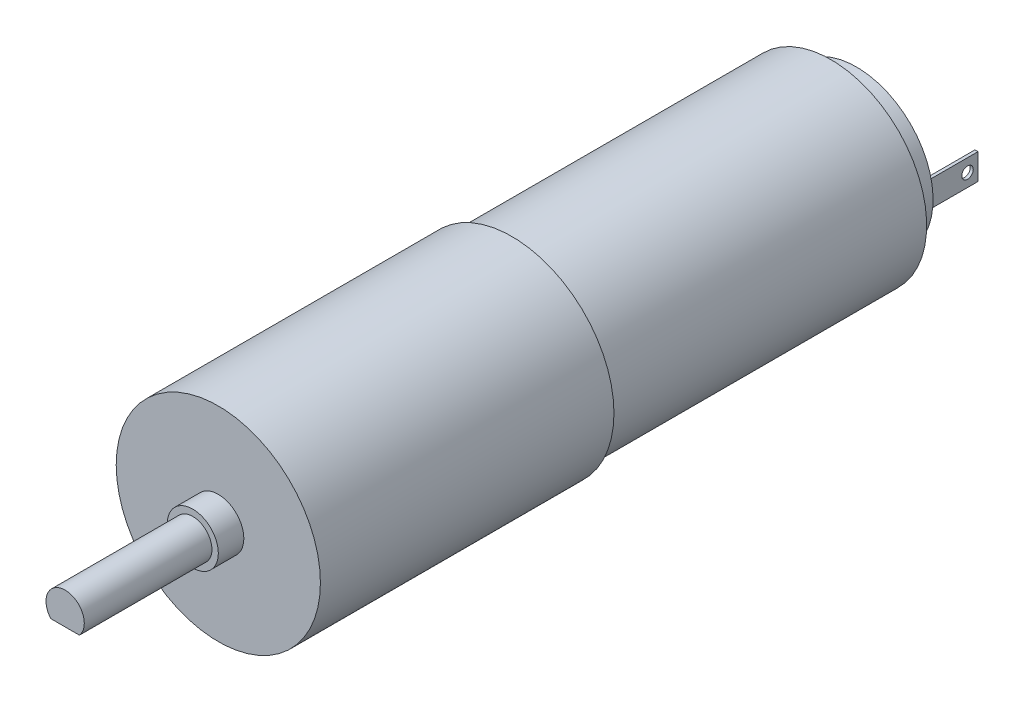
ISO-10303-21;
HEADER;
FILE_DESCRIPTION(('STEP AP214'),'2;1');
FILE_NAME('part.step','',(''),(''),'','','');
FILE_SCHEMA(('AUTOMOTIVE_DESIGN { 1 0 10303 214 1 1 1 1 }'));
ENDSEC;
DATA;
#1=APPLICATION_CONTEXT('core data for automotive mechanical design processes');
#2=APPLICATION_PROTOCOL_DEFINITION('international standard','automotive_design',2000,#1);
#3=PRODUCT_CONTEXT('',#1,'mechanical');
#4=PRODUCT('Part','Part','',(#3));
#5=PRODUCT_RELATED_PRODUCT_CATEGORY('part','',(#4));
#6=PRODUCT_DEFINITION_FORMATION('','',#4);
#7=PRODUCT_DEFINITION_CONTEXT('part definition',#1,'design');
#8=PRODUCT_DEFINITION('design','',#6,#7);
#9=PRODUCT_DEFINITION_SHAPE('','',#8);
#10=(LENGTH_UNIT() NAMED_UNIT(*) SI_UNIT(.MILLI.,.METRE.));
#11=(NAMED_UNIT(*) PLANE_ANGLE_UNIT() SI_UNIT($,.RADIAN.));
#12=(NAMED_UNIT(*) SI_UNIT($,.STERADIAN.) SOLID_ANGLE_UNIT());
#13=UNCERTAINTY_MEASURE_WITH_UNIT(LENGTH_MEASURE(1.E-05),#10,'distance_accuracy_value','');
#14=(GEOMETRIC_REPRESENTATION_CONTEXT(3) GLOBAL_UNCERTAINTY_ASSIGNED_CONTEXT((#13)) GLOBAL_UNIT_ASSIGNED_CONTEXT((#10,
#11,#12)) REPRESENTATION_CONTEXT('',''));
#15=CARTESIAN_POINT('',(0.,0.,0.));
#16=DIRECTION('',(0.,0.,1.));
#17=DIRECTION('',(1.,0.,0.));
#18=AXIS2_PLACEMENT_3D('',#15,#16,#17);
#19=CARTESIAN_POINT('',(0.,0.,-27.));
#20=DIRECTION('',(0.,0.,-1.));
#21=DIRECTION('',(-1.,0.,0.));
#22=AXIS2_PLACEMENT_3D('',#19,#20,#21);
#23=PLANE('',#22);
#24=CARTESIAN_POINT('',(0.,0.,-27.));
#25=DIRECTION('',(0.,0.,-1.));
#26=DIRECTION('',(-1.,0.,0.));
#27=AXIS2_PLACEMENT_3D('',#24,#25,#26);
#28=CIRCLE('',#27,6.);
#29=CARTESIAN_POINT('',(-6.,0.,-27.));
#30=VERTEX_POINT('',#29);
#31=EDGE_CURVE('E149',#30,#30,#28,.T.);
#32=ORIENTED_EDGE('',*,*,#31,.T.);
#33=EDGE_LOOP('',(#32));
#34=FACE_BOUND('',#33,.T.);
#35=DIRECTION('',(1.,0.,0.));
#36=VECTOR('',#35,1.);
#37=CARTESIAN_POINT('',(5.52102003642987,1.01467395264138,-27.));
#38=LINE('',#37,#36);
#39=CARTESIAN_POINT('',(5.28227322404372,1.01467395264138,-27.));
#40=VERTEX_POINT('',#39);
#41=CARTESIAN_POINT('',(5.52102003642987,1.01467395264138,-27.));
#42=VERTEX_POINT('',#41);
#43=EDGE_CURVE('E395',#40,#42,#38,.T.);
#44=ORIENTED_EDGE('',*,*,#43,.F.);
#45=DIRECTION('',(0.,1.,0.));
#46=VECTOR('',#45,1.);
#47=CARTESIAN_POINT('',(5.28227322404372,-1.01467395264138,-27.));
#48=LINE('',#47,#46);
#49=CARTESIAN_POINT('',(5.28227322404372,-1.01467395264138,-27.));
#50=VERTEX_POINT('',#49);
#51=EDGE_CURVE('E376',#50,#40,#48,.T.);
#52=ORIENTED_EDGE('',*,*,#51,.F.);
#53=DIRECTION('',(-1.,0.,0.));
#54=VECTOR('',#53,1.);
#55=CARTESIAN_POINT('',(5.52102003642987,-1.01467395264138,-27.));
#56=LINE('',#55,#54);
#57=CARTESIAN_POINT('',(5.52102003642987,-1.01467395264138,-27.));
#58=VERTEX_POINT('',#57);
#59=EDGE_CURVE('E382',#58,#50,#56,.T.);
#60=ORIENTED_EDGE('',*,*,#59,.F.);
#61=DIRECTION('',(0.,-1.,0.));
#62=VECTOR('',#61,1.);
#63=CARTESIAN_POINT('',(5.52102003642987,-1.01467395264138,-27.));
#64=LINE('',#63,#62);
#65=EDGE_CURVE('E398',#42,#58,#64,.T.);
#66=ORIENTED_EDGE('',*,*,#65,.F.);
#67=EDGE_LOOP('',(#44,#52,#60,#66));
#68=FACE_BOUND('',#67,.T.);
#69=DIRECTION('',(1.,0.,0.));
#70=VECTOR('',#69,1.);
#71=CARTESIAN_POINT('',(-5.26735154826958,1.01467395264138,-27.));
#72=LINE('',#71,#70);
#73=CARTESIAN_POINT('',(-5.47625500910747,1.01467395264138,-27.));
#74=VERTEX_POINT('',#73);
#75=CARTESIAN_POINT('',(-5.26735154826958,1.01467395264138,-27.));
#76=VERTEX_POINT('',#75);
#77=EDGE_CURVE('E336',#74,#76,#72,.T.);
#78=ORIENTED_EDGE('',*,*,#77,.F.);
#79=DIRECTION('',(0.,1.,0.));
#80=VECTOR('',#79,1.);
#81=CARTESIAN_POINT('',(-5.47625500910747,-1.01467395264138,-27.));
#82=LINE('',#81,#80);
#83=CARTESIAN_POINT('',(-5.47625500910747,-1.01467395264138,-27.));
#84=VERTEX_POINT('',#83);
#85=EDGE_CURVE('E331',#84,#74,#82,.T.);
#86=ORIENTED_EDGE('',*,*,#85,.F.);
#87=DIRECTION('',(-1.,0.,0.));
#88=VECTOR('',#87,1.);
#89=CARTESIAN_POINT('',(-5.26735154826958,-1.01467395264138,-27.));
#90=LINE('',#89,#88);
#91=CARTESIAN_POINT('',(-5.26735154826958,-1.01467395264138,-27.));
#92=VERTEX_POINT('',#91);
#93=EDGE_CURVE('E347',#92,#84,#90,.T.);
#94=ORIENTED_EDGE('',*,*,#93,.F.);
#95=DIRECTION('',(0.,-1.,0.));
#96=VECTOR('',#95,1.);
#97=CARTESIAN_POINT('',(-5.26735154826958,-1.01467395264138,-27.));
#98=LINE('',#97,#96);
#99=EDGE_CURVE('E359',#76,#92,#98,.T.);
#100=ORIENTED_EDGE('',*,*,#99,.F.);
#101=EDGE_LOOP('',(#78,#86,#94,#100));
#102=FACE_BOUND('',#101,.T.);
#103=ADVANCED_FACE('F41',(#34,#68,#102),#23,.T.);
#104=CARTESIAN_POINT('',(0.,0.,23.));
#105=DIRECTION('',(0.,0.,-1.));
#106=DIRECTION('',(-1.,0.,0.));
#107=AXIS2_PLACEMENT_3D('',#104,#105,#106);
#108=CYLINDRICAL_SURFACE('',#107,8.);
#109=CARTESIAN_POINT('',(0.,0.,23.));
#110=DIRECTION('',(0.,0.,1.));
#111=DIRECTION('',(1.,0.,0.));
#112=AXIS2_PLACEMENT_3D('',#109,#110,#111);
#113=CIRCLE('',#112,8.);
#114=CARTESIAN_POINT('',(8.,0.,23.));
#115=VERTEX_POINT('',#114);
#116=EDGE_CURVE('E164',#115,#115,#113,.T.);
#117=ORIENTED_EDGE('',*,*,#116,.F.);
#118=EDGE_LOOP('',(#117));
#119=FACE_BOUND('',#118,.T.);
#120=CARTESIAN_POINT('',(0.,0.,0.));
#121=DIRECTION('',(0.,0.,1.));
#122=DIRECTION('',(1.,0.,0.));
#123=AXIS2_PLACEMENT_3D('',#120,#121,#122);
#124=CIRCLE('',#123,8.);
#125=CARTESIAN_POINT('',(8.,0.,0.));
#126=VERTEX_POINT('',#125);
#127=EDGE_CURVE('E155',#126,#126,#124,.T.);
#128=ORIENTED_EDGE('',*,*,#127,.T.);
#129=EDGE_LOOP('',(#128));
#130=FACE_BOUND('',#129,.T.);
#131=ADVANCED_FACE('F43',(#119,#130),#108,.T.);
#132=CARTESIAN_POINT('',(0.,0.,23.));
#133=DIRECTION('',(0.,0.,1.));
#134=DIRECTION('',(1.,0.,0.));
#135=AXIS2_PLACEMENT_3D('',#132,#133,#134);
#136=PLANE('',#135);
#137=CARTESIAN_POINT('',(0.,0.,23.));
#138=DIRECTION('',(0.,0.,1.));
#139=DIRECTION('',(1.,0.,0.));
#140=AXIS2_PLACEMENT_3D('',#137,#138,#139);
#141=CIRCLE('',#140,2.);
#142=CARTESIAN_POINT('',(2.,0.,23.));
#143=VERTEX_POINT('',#142);
#144=EDGE_CURVE('E161',#143,#143,#141,.T.);
#145=ORIENTED_EDGE('',*,*,#144,.F.);
#146=EDGE_LOOP('',(#145));
#147=FACE_BOUND('',#146,.T.);
#148=ORIENTED_EDGE('',*,*,#116,.T.);
#149=EDGE_LOOP('',(#148));
#150=FACE_BOUND('',#149,.T.);
#151=ADVANCED_FACE('F203',(#147,#150),#136,.T.);
#152=CARTESIAN_POINT('',(0.,0.,0.));
#153=DIRECTION('',(0.,0.,1.));
#154=DIRECTION('',(1.,0.,0.));
#155=AXIS2_PLACEMENT_3D('',#152,#153,#154);
#156=PLANE('',#155);
#157=DIRECTION('',(1.,0.,0.));
#158=VECTOR('',#157,1.);
#159=CARTESIAN_POINT('',(7.07287431693989,-6.,0.));
#160=LINE('',#159,#158);
#161=CARTESIAN_POINT('',(-4.5,-6.,0.));
#162=VERTEX_POINT('',#161);
#163=CARTESIAN_POINT('',(4.5,-6.,0.));
#164=VERTEX_POINT('',#163);
#165=EDGE_CURVE('E230',#162,#164,#160,.T.);
#166=ORIENTED_EDGE('',*,*,#165,.T.);
#167=CARTESIAN_POINT('',(0.,0.,0.));
#168=DIRECTION('',(0.,0.,1.));
#169=DIRECTION('',(1.,0.,0.));
#170=AXIS2_PLACEMENT_3D('',#167,#168,#169);
#171=CIRCLE('',#170,7.5);
#172=EDGE_CURVE('E168',#162,#164,#171,.F.);
#173=ORIENTED_EDGE('',*,*,#172,.F.);
#174=EDGE_LOOP('',(#166,#173));
#175=FACE_BOUND('',#174,.T.);
#176=ORIENTED_EDGE('',*,*,#127,.F.);
#177=EDGE_LOOP('',(#176));
#178=FACE_BOUND('',#177,.T.);
#179=ADVANCED_FACE('F216',(#175,#178),#156,.F.);
#180=CARTESIAN_POINT('',(0.,0.,25.));
#181=DIRECTION('',(0.,0.,-1.));
#182=DIRECTION('',(-1.,0.,0.));
#183=AXIS2_PLACEMENT_3D('',#180,#181,#182);
#184=CYLINDRICAL_SURFACE('',#183,2.);
#185=CARTESIAN_POINT('',(0.,0.,25.));
#186=DIRECTION('',(0.,0.,1.));
#187=DIRECTION('',(1.,0.,0.));
#188=AXIS2_PLACEMENT_3D('',#185,#186,#187);
#189=CIRCLE('',#188,2.);
#190=CARTESIAN_POINT('',(2.,0.,25.));
#191=VERTEX_POINT('',#190);
#192=EDGE_CURVE('E158',#191,#191,#189,.T.);
#193=ORIENTED_EDGE('',*,*,#192,.F.);
#194=EDGE_LOOP('',(#193));
#195=FACE_BOUND('',#194,.T.);
#196=ORIENTED_EDGE('',*,*,#144,.T.);
#197=EDGE_LOOP('',(#196));
#198=FACE_BOUND('',#197,.T.);
#199=ADVANCED_FACE('F219',(#195,#198),#184,.T.);
#200=CARTESIAN_POINT('',(0.,0.,25.));
#201=DIRECTION('',(0.,0.,1.));
#202=DIRECTION('',(1.,0.,0.));
#203=AXIS2_PLACEMENT_3D('',#200,#201,#202);
#204=PLANE('',#203);
#205=CARTESIAN_POINT('',(0.,0.,25.));
#206=DIRECTION('',(0.,0.,1.));
#207=DIRECTION('',(1.,0.,0.));
#208=AXIS2_PLACEMENT_3D('',#205,#206,#207);
#209=CIRCLE('',#208,1.5);
#210=CARTESIAN_POINT('',(1.5,0.,25.));
#211=VERTEX_POINT('',#210);
#212=EDGE_CURVE('E150',#211,#211,#209,.T.);
#213=ORIENTED_EDGE('',*,*,#212,.F.);
#214=EDGE_LOOP('',(#213));
#215=FACE_BOUND('',#214,.T.);
#216=ORIENTED_EDGE('',*,*,#192,.T.);
#217=EDGE_LOOP('',(#216));
#218=FACE_BOUND('',#217,.T.);
#219=ADVANCED_FACE('F224',(#215,#218),#204,.T.);
#220=CARTESIAN_POINT('',(0.,0.,35.));
#221=DIRECTION('',(0.,0.,1.));
#222=DIRECTION('',(1.,0.,0.));
#223=AXIS2_PLACEMENT_3D('',#220,#221,#222);
#224=PLANE('',#223);
#225=DIRECTION('',(-1.,0.,0.));
#226=VECTOR('',#225,1.);
#227=CARTESIAN_POINT('',(-2.29793806921676,-0.999752276866803,35.));
#228=LINE('',#227,#226);
#229=CARTESIAN_POINT('',(1.11825550966657,-0.999752276866803,35.));
#230=VERTEX_POINT('',#229);
#231=CARTESIAN_POINT('',(-1.11825550966657,-0.999752276866803,35.));
#232=VERTEX_POINT('',#231);
#233=EDGE_CURVE('E135',#230,#232,#228,.T.);
#234=ORIENTED_EDGE('',*,*,#233,.F.);
#235=CARTESIAN_POINT('',(0.,0.,35.));
#236=DIRECTION('',(0.,0.,1.));
#237=DIRECTION('',(1.,0.,0.));
#238=AXIS2_PLACEMENT_3D('',#235,#236,#237);
#239=CIRCLE('',#238,1.5);
#240=EDGE_CURVE('E143',#230,#232,#239,.T.);
#241=ORIENTED_EDGE('',*,*,#240,.T.);
#242=EDGE_LOOP('',(#234,#241));
#243=FACE_BOUND('',#242,.T.);
#244=ADVANCED_FACE('F142',(#243),#224,.T.);
#245=CARTESIAN_POINT('',(0.,0.,35.));
#246=DIRECTION('',(0.,0.,-1.));
#247=DIRECTION('',(-1.,0.,0.));
#248=AXIS2_PLACEMENT_3D('',#245,#246,#247);
#249=CYLINDRICAL_SURFACE('',#248,1.5);
#250=ORIENTED_EDGE('',*,*,#240,.F.);
#251=DIRECTION('',(0.,0.,-1.));
#252=VECTOR('',#251,1.);
#253=CARTESIAN_POINT('',(1.11825550966657,-0.999752276866803,35.));
#254=LINE('',#253,#252);
#255=CARTESIAN_POINT('',(1.11825550966657,-0.999752276866803,29.));
#256=VERTEX_POINT('',#255);
#257=EDGE_CURVE('E11',#230,#256,#254,.T.);
#258=ORIENTED_EDGE('',*,*,#257,.T.);
#259=CARTESIAN_POINT('',(0.,0.,29.));
#260=DIRECTION('',(0.,0.,-1.));
#261=DIRECTION('',(-1.,0.,0.));
#262=AXIS2_PLACEMENT_3D('',#259,#260,#261);
#263=CIRCLE('',#262,1.5);
#264=CARTESIAN_POINT('',(-1.11825550966657,-0.999752276866803,29.));
#265=VERTEX_POINT('',#264);
#266=EDGE_CURVE('E180',#256,#265,#263,.T.);
#267=ORIENTED_EDGE('',*,*,#266,.T.);
#268=DIRECTION('',(0.,0.,-1.));
#269=VECTOR('',#268,1.);
#270=CARTESIAN_POINT('',(-1.11825550966657,-0.999752276866803,35.));
#271=LINE('',#270,#269);
#272=EDGE_CURVE('E50',#265,#232,#271,.F.);
#273=ORIENTED_EDGE('',*,*,#272,.T.);
#274=EDGE_LOOP('',(#250,#258,#267,#273));
#275=FACE_BOUND('',#274,.T.);
#276=ORIENTED_EDGE('',*,*,#212,.T.);
#277=EDGE_LOOP('',(#276));
#278=FACE_BOUND('',#277,.T.);
#279=ADVANCED_FACE('F146',(#275,#278),#249,.T.);
#280=CARTESIAN_POINT('',(0.,0.,-25.));
#281=DIRECTION('',(0.,0.,1.));
#282=DIRECTION('',(1.,0.,0.));
#283=AXIS2_PLACEMENT_3D('',#280,#281,#282);
#284=CYLINDRICAL_SURFACE('',#283,7.5);
#285=CARTESIAN_POINT('',(0.,0.,-25.));
#286=DIRECTION('',(0.,0.,-1.));
#287=DIRECTION('',(-1.,0.,0.));
#288=AXIS2_PLACEMENT_3D('',#285,#286,#287);
#289=CIRCLE('',#288,7.5);
#290=CARTESIAN_POINT('',(-4.5,-6.,-25.));
#291=VERTEX_POINT('',#290);
#292=CARTESIAN_POINT('',(4.5,-6.,-25.));
#293=VERTEX_POINT('',#292);
#294=EDGE_CURVE('E176',#291,#293,#289,.T.);
#295=ORIENTED_EDGE('',*,*,#294,.F.);
#296=DIRECTION('',(0.,0.,1.));
#297=VECTOR('',#296,1.);
#298=CARTESIAN_POINT('',(-4.5,-6.,-25.));
#299=LINE('',#298,#297);
#300=EDGE_CURVE('E244',#291,#162,#299,.T.);
#301=ORIENTED_EDGE('',*,*,#300,.T.);
#302=ORIENTED_EDGE('',*,*,#172,.T.);
#303=DIRECTION('',(0.,0.,1.));
#304=VECTOR('',#303,1.);
#305=CARTESIAN_POINT('',(4.5,-6.,-25.));
#306=LINE('',#305,#304);
#307=EDGE_CURVE('E236',#164,#293,#306,.F.);
#308=ORIENTED_EDGE('',*,*,#307,.T.);
#309=EDGE_LOOP('',(#295,#301,#302,#308));
#310=FACE_BOUND('',#309,.T.);
#311=ADVANCED_FACE('F242',(#310),#284,.T.);
#312=CARTESIAN_POINT('',(0.,0.,-25.));
#313=DIRECTION('',(0.,0.,-1.));
#314=DIRECTION('',(-1.,0.,0.));
#315=AXIS2_PLACEMENT_3D('',#312,#313,#314);
#316=PLANE('',#315);
#317=DIRECTION('',(1.,0.,0.));
#318=VECTOR('',#317,1.);
#319=CARTESIAN_POINT('',(0.,-6.,-25.));
#320=LINE('',#319,#318);
#321=CARTESIAN_POINT('',(0.,-6.,-25.));
#322=VERTEX_POINT('',#321);
#323=EDGE_CURVE('E237',#291,#322,#320,.T.);
#324=ORIENTED_EDGE('',*,*,#323,.F.);
#325=ORIENTED_EDGE('',*,*,#294,.T.);
#326=EDGE_CURVE('E416',#322,#293,#320,.T.);
#327=ORIENTED_EDGE('',*,*,#326,.F.);
#328=CARTESIAN_POINT('',(0.,0.,-25.));
#329=DIRECTION('',(0.,0.,-1.));
#330=DIRECTION('',(-1.,0.,0.));
#331=AXIS2_PLACEMENT_3D('',#328,#329,#330);
#332=CIRCLE('',#331,6.);
#333=EDGE_CURVE('E172',#322,#322,#332,.T.);
#334=ORIENTED_EDGE('',*,*,#333,.F.);
#335=EDGE_LOOP('',(#324,#325,#327,#334));
#336=FACE_BOUND('',#335,.T.);
#337=ADVANCED_FACE('F213',(#336),#316,.T.);
#338=CARTESIAN_POINT('',(0.,0.,-27.));
#339=DIRECTION('',(0.,0.,1.));
#340=DIRECTION('',(1.,0.,0.));
#341=AXIS2_PLACEMENT_3D('',#338,#339,#340);
#342=CYLINDRICAL_SURFACE('',#341,6.);
#343=ORIENTED_EDGE('',*,*,#333,.T.);
#344=EDGE_LOOP('',(#343));
#345=FACE_BOUND('',#344,.T.);
#346=ORIENTED_EDGE('',*,*,#31,.F.);
#347=EDGE_LOOP('',(#346));
#348=FACE_BOUND('',#347,.T.);
#349=ADVANCED_FACE('F209',(#345,#348),#342,.T.);
#350=CARTESIAN_POINT('',(0.,-6.,0.));
#351=DIRECTION('',(0.,1.,0.));
#352=DIRECTION('',(0.,0.,1.));
#353=AXIS2_PLACEMENT_3D('',#350,#351,#352);
#354=PLANE('',#353);
#355=ORIENTED_EDGE('',*,*,#323,.T.);
#356=ORIENTED_EDGE('',*,*,#326,.T.);
#357=ORIENTED_EDGE('',*,*,#307,.F.);
#358=ORIENTED_EDGE('',*,*,#165,.F.);
#359=ORIENTED_EDGE('',*,*,#300,.F.);
#360=EDGE_LOOP('',(#355,#356,#357,#358,#359));
#361=FACE_BOUND('',#360,.T.);
#362=ADVANCED_FACE('F212',(#361),#354,.F.);
#363=CARTESIAN_POINT('',(5.28227322404372,-1.01467395264138,-31.));
#364=DIRECTION('',(1.,0.,0.));
#365=DIRECTION('',(0.,0.,-1.));
#366=AXIS2_PLACEMENT_3D('',#363,#364,#365);
#367=PLANE('',#366);
#368=CARTESIAN_POINT('',(5.28227322404372,0.,-30.1778509900125));
#369=DIRECTION('',(1.,0.,0.));
#370=DIRECTION('',(0.,0.,-1.));
#371=AXIS2_PLACEMENT_3D('',#368,#369,#370);
#372=CIRCLE('',#371,0.451828616412604);
#373=CARTESIAN_POINT('',(5.28227322404372,0.,-30.6296796064251));
#374=VERTEX_POINT('',#373);
#375=EDGE_CURVE('E329',#374,#374,#372,.T.);
#376=ORIENTED_EDGE('',*,*,#375,.T.);
#377=EDGE_LOOP('',(#376));
#378=FACE_BOUND('',#377,.T.);
#379=ORIENTED_EDGE('',*,*,#51,.T.);
#380=DIRECTION('',(0.,0.,1.));
#381=VECTOR('',#380,1.);
#382=CARTESIAN_POINT('',(5.28227322404372,1.01467395264138,-31.));
#383=LINE('',#382,#381);
#384=CARTESIAN_POINT('',(5.28227322404372,1.01467395264138,-31.));
#385=VERTEX_POINT('',#384);
#386=EDGE_CURVE('E414',#385,#40,#383,.T.);
#387=ORIENTED_EDGE('',*,*,#386,.F.);
#388=DIRECTION('',(0.,1.,0.));
#389=VECTOR('',#388,1.);
#390=CARTESIAN_POINT('',(5.28227322404372,-1.01467395264138,-31.));
#391=LINE('',#390,#389);
#392=CARTESIAN_POINT('',(5.28227322404372,-1.01467395264138,-31.));
#393=VERTEX_POINT('',#392);
#394=EDGE_CURVE('E377',#393,#385,#391,.T.);
#395=ORIENTED_EDGE('',*,*,#394,.F.);
#396=DIRECTION('',(0.,0.,1.));
#397=VECTOR('',#396,1.);
#398=CARTESIAN_POINT('',(5.28227322404372,-1.01467395264138,-31.));
#399=LINE('',#398,#397);
#400=EDGE_CURVE('E391',#393,#50,#399,.T.);
#401=ORIENTED_EDGE('',*,*,#400,.T.);
#402=EDGE_LOOP('',(#379,#387,#395,#401));
#403=FACE_BOUND('',#402,.T.);
#404=ADVANCED_FACE('F278',(#378,#403),#367,.F.);
#405=CARTESIAN_POINT('',(5.52102003642987,1.01467395264138,-31.));
#406=DIRECTION('',(0.,-1.,0.));
#407=DIRECTION('',(0.,0.,-1.));
#408=AXIS2_PLACEMENT_3D('',#405,#406,#407);
#409=PLANE('',#408);
#410=ORIENTED_EDGE('',*,*,#43,.T.);
#411=DIRECTION('',(0.,0.,1.));
#412=VECTOR('',#411,1.);
#413=CARTESIAN_POINT('',(5.52102003642987,1.01467395264138,-31.));
#414=LINE('',#413,#412);
#415=CARTESIAN_POINT('',(5.52102003642987,1.01467395264138,-31.));
#416=VERTEX_POINT('',#415);
#417=EDGE_CURVE('E410',#416,#42,#414,.T.);
#418=ORIENTED_EDGE('',*,*,#417,.F.);
#419=DIRECTION('',(1.,0.,0.));
#420=VECTOR('',#419,1.);
#421=CARTESIAN_POINT('',(5.52102003642987,1.01467395264138,-31.));
#422=LINE('',#421,#420);
#423=EDGE_CURVE('E381',#385,#416,#422,.T.);
#424=ORIENTED_EDGE('',*,*,#423,.F.);
#425=ORIENTED_EDGE('',*,*,#386,.T.);
#426=EDGE_LOOP('',(#410,#418,#424,#425));
#427=FACE_BOUND('',#426,.T.);
#428=ADVANCED_FACE('F281',(#427),#409,.F.);
#429=CARTESIAN_POINT('',(5.52102003642987,-1.01467395264138,-31.));
#430=DIRECTION('',(-1.,0.,0.));
#431=DIRECTION('',(0.,0.,1.));
#432=AXIS2_PLACEMENT_3D('',#429,#430,#431);
#433=PLANE('',#432);
#434=CARTESIAN_POINT('',(5.52102003642987,0.,-30.1778509900125));
#435=DIRECTION('',(1.,0.,0.));
#436=DIRECTION('',(0.,0.,-1.));
#437=AXIS2_PLACEMENT_3D('',#434,#435,#436);
#438=CIRCLE('',#437,0.451828616412604);
#439=CARTESIAN_POINT('',(5.52102003642987,0.,-30.6296796064251));
#440=VERTEX_POINT('',#439);
#441=EDGE_CURVE('E186',#440,#440,#438,.T.);
#442=ORIENTED_EDGE('',*,*,#441,.F.);
#443=EDGE_LOOP('',(#442));
#444=FACE_BOUND('',#443,.T.);
#445=ORIENTED_EDGE('',*,*,#65,.T.);
#446=DIRECTION('',(0.,0.,1.));
#447=VECTOR('',#446,1.);
#448=CARTESIAN_POINT('',(5.52102003642987,-1.01467395264138,-31.));
#449=LINE('',#448,#447);
#450=CARTESIAN_POINT('',(5.52102003642987,-1.01467395264138,-31.));
#451=VERTEX_POINT('',#450);
#452=EDGE_CURVE('E407',#451,#58,#449,.T.);
#453=ORIENTED_EDGE('',*,*,#452,.F.);
#454=DIRECTION('',(0.,-1.,0.));
#455=VECTOR('',#454,1.);
#456=CARTESIAN_POINT('',(5.52102003642987,-1.01467395264138,-31.));
#457=LINE('',#456,#455);
#458=EDGE_CURVE('E385',#416,#451,#457,.T.);
#459=ORIENTED_EDGE('',*,*,#458,.F.);
#460=ORIENTED_EDGE('',*,*,#417,.T.);
#461=EDGE_LOOP('',(#445,#453,#459,#460));
#462=FACE_BOUND('',#461,.T.);
#463=ADVANCED_FACE('F285',(#444,#462),#433,.F.);
#464=CARTESIAN_POINT('',(5.52102003642987,-1.01467395264138,-31.));
#465=DIRECTION('',(0.,1.,0.));
#466=DIRECTION('',(0.,0.,1.));
#467=AXIS2_PLACEMENT_3D('',#464,#465,#466);
#468=PLANE('',#467);
#469=ORIENTED_EDGE('',*,*,#59,.T.);
#470=ORIENTED_EDGE('',*,*,#400,.F.);
#471=DIRECTION('',(-1.,0.,0.));
#472=VECTOR('',#471,1.);
#473=CARTESIAN_POINT('',(5.52102003642987,-1.01467395264138,-31.));
#474=LINE('',#473,#472);
#475=EDGE_CURVE('E388',#451,#393,#474,.T.);
#476=ORIENTED_EDGE('',*,*,#475,.F.);
#477=ORIENTED_EDGE('',*,*,#452,.T.);
#478=EDGE_LOOP('',(#469,#470,#476,#477));
#479=FACE_BOUND('',#478,.T.);
#480=ADVANCED_FACE('F289',(#479),#468,.F.);
#481=CARTESIAN_POINT('',(0.,0.,-31.));
#482=DIRECTION('',(0.,0.,1.));
#483=DIRECTION('',(1.,0.,0.));
#484=AXIS2_PLACEMENT_3D('',#481,#482,#483);
#485=PLANE('',#484);
#486=ORIENTED_EDGE('',*,*,#394,.T.);
#487=ORIENTED_EDGE('',*,*,#423,.T.);
#488=ORIENTED_EDGE('',*,*,#458,.T.);
#489=ORIENTED_EDGE('',*,*,#475,.T.);
#490=EDGE_LOOP('',(#486,#487,#488,#489));
#491=FACE_BOUND('',#490,.T.);
#492=ADVANCED_FACE('F293',(#491),#485,.F.);
#493=CARTESIAN_POINT('',(-5.47625500910747,-1.01467395264138,-31.));
#494=DIRECTION('',(1.,0.,0.));
#495=DIRECTION('',(0.,0.,-1.));
#496=AXIS2_PLACEMENT_3D('',#493,#494,#495);
#497=PLANE('',#496);
#498=CARTESIAN_POINT('',(-5.47625500910747,0.,-30.1778509900125));
#499=DIRECTION('',(1.,0.,0.));
#500=DIRECTION('',(0.,0.,-1.));
#501=AXIS2_PLACEMENT_3D('',#498,#499,#500);
#502=CIRCLE('',#501,0.451828616412604);
#503=CARTESIAN_POINT('',(-5.47625500910747,0.,-30.6296796064251));
#504=VERTEX_POINT('',#503);
#505=EDGE_CURVE('E185',#504,#504,#502,.T.);
#506=ORIENTED_EDGE('',*,*,#505,.T.);
#507=EDGE_LOOP('',(#506));
#508=FACE_BOUND('',#507,.T.);
#509=ORIENTED_EDGE('',*,*,#85,.T.);
#510=DIRECTION('',(0.,0.,1.));
#511=VECTOR('',#510,1.);
#512=CARTESIAN_POINT('',(-5.47625500910747,1.01467395264138,-31.));
#513=LINE('',#512,#511);
#514=CARTESIAN_POINT('',(-5.47625500910747,1.01467395264138,-31.));
#515=VERTEX_POINT('',#514);
#516=EDGE_CURVE('E373',#515,#74,#513,.T.);
#517=ORIENTED_EDGE('',*,*,#516,.F.);
#518=DIRECTION('',(0.,1.,0.));
#519=VECTOR('',#518,1.);
#520=CARTESIAN_POINT('',(-5.47625500910747,-1.01467395264138,-31.));
#521=LINE('',#520,#519);
#522=CARTESIAN_POINT('',(-5.47625500910747,-1.01467395264138,-31.));
#523=VERTEX_POINT('',#522);
#524=EDGE_CURVE('E342',#523,#515,#521,.T.);
#525=ORIENTED_EDGE('',*,*,#524,.F.);
#526=DIRECTION('',(0.,0.,1.));
#527=VECTOR('',#526,1.);
#528=CARTESIAN_POINT('',(-5.47625500910747,-1.01467395264138,-31.));
#529=LINE('',#528,#527);
#530=EDGE_CURVE('E355',#523,#84,#529,.T.);
#531=ORIENTED_EDGE('',*,*,#530,.T.);
#532=EDGE_LOOP('',(#509,#517,#525,#531));
#533=FACE_BOUND('',#532,.T.);
#534=ADVANCED_FACE('F297',(#508,#533),#497,.F.);
#535=CARTESIAN_POINT('',(-5.26735154826958,1.01467395264138,-31.));
#536=DIRECTION('',(0.,-1.,0.));
#537=DIRECTION('',(0.,0.,-1.));
#538=AXIS2_PLACEMENT_3D('',#535,#536,#537);
#539=PLANE('',#538);
#540=ORIENTED_EDGE('',*,*,#77,.T.);
#541=DIRECTION('',(0.,0.,1.));
#542=VECTOR('',#541,1.);
#543=CARTESIAN_POINT('',(-5.26735154826958,1.01467395264138,-31.));
#544=LINE('',#543,#542);
#545=CARTESIAN_POINT('',(-5.26735154826958,1.01467395264138,-31.));
#546=VERTEX_POINT('',#545);
#547=EDGE_CURVE('E369',#546,#76,#544,.T.);
#548=ORIENTED_EDGE('',*,*,#547,.F.);
#549=DIRECTION('',(1.,0.,0.));
#550=VECTOR('',#549,1.);
#551=CARTESIAN_POINT('',(-5.26735154826958,1.01467395264138,-31.));
#552=LINE('',#551,#550);
#553=EDGE_CURVE('E346',#515,#546,#552,.T.);
#554=ORIENTED_EDGE('',*,*,#553,.F.);
#555=ORIENTED_EDGE('',*,*,#516,.T.);
#556=EDGE_LOOP('',(#540,#548,#554,#555));
#557=FACE_BOUND('',#556,.T.);
#558=ADVANCED_FACE('F301',(#557),#539,.F.);
#559=CARTESIAN_POINT('',(-5.26735154826958,-1.01467395264138,-31.));
#560=DIRECTION('',(-1.,0.,0.));
#561=DIRECTION('',(0.,0.,1.));
#562=AXIS2_PLACEMENT_3D('',#559,#560,#561);
#563=PLANE('',#562);
#564=CARTESIAN_POINT('',(-5.26735154826958,0.,-30.1778509900125));
#565=DIRECTION('',(-1.,0.,0.));
#566=DIRECTION('',(0.,0.,1.));
#567=AXIS2_PLACEMENT_3D('',#564,#565,#566);
#568=CIRCLE('',#567,0.451828616412604);
#569=CARTESIAN_POINT('',(-5.26735154826958,0.,-29.7260223735999));
#570=VERTEX_POINT('',#569);
#571=EDGE_CURVE('E181',#570,#570,#568,.T.);
#572=ORIENTED_EDGE('',*,*,#571,.T.);
#573=EDGE_LOOP('',(#572));
#574=FACE_BOUND('',#573,.T.);
#575=ORIENTED_EDGE('',*,*,#99,.T.);
#576=DIRECTION('',(0.,0.,1.));
#577=VECTOR('',#576,1.);
#578=CARTESIAN_POINT('',(-5.26735154826958,-1.01467395264138,-31.));
#579=LINE('',#578,#577);
#580=CARTESIAN_POINT('',(-5.26735154826958,-1.01467395264138,-31.));
#581=VERTEX_POINT('',#580);
#582=EDGE_CURVE('E64',#581,#92,#579,.T.);
#583=ORIENTED_EDGE('',*,*,#582,.F.);
#584=DIRECTION('',(0.,-1.,0.));
#585=VECTOR('',#584,1.);
#586=CARTESIAN_POINT('',(-5.26735154826958,-1.01467395264138,-31.));
#587=LINE('',#586,#585);
#588=EDGE_CURVE('E350',#546,#581,#587,.T.);
#589=ORIENTED_EDGE('',*,*,#588,.F.);
#590=ORIENTED_EDGE('',*,*,#547,.T.);
#591=EDGE_LOOP('',(#575,#583,#589,#590));
#592=FACE_BOUND('',#591,.T.);
#593=ADVANCED_FACE('F305',(#574,#592),#563,.F.);
#594=CARTESIAN_POINT('',(-5.26735154826958,-1.01467395264138,-31.));
#595=DIRECTION('',(0.,1.,0.));
#596=DIRECTION('',(0.,0.,1.));
#597=AXIS2_PLACEMENT_3D('',#594,#595,#596);
#598=PLANE('',#597);
#599=ORIENTED_EDGE('',*,*,#93,.T.);
#600=ORIENTED_EDGE('',*,*,#530,.F.);
#601=DIRECTION('',(-1.,0.,0.));
#602=VECTOR('',#601,1.);
#603=CARTESIAN_POINT('',(-5.26735154826958,-1.01467395264138,-31.));
#604=LINE('',#603,#602);
#605=EDGE_CURVE('E353',#581,#523,#604,.T.);
#606=ORIENTED_EDGE('',*,*,#605,.F.);
#607=ORIENTED_EDGE('',*,*,#582,.T.);
#608=EDGE_LOOP('',(#599,#600,#606,#607));
#609=FACE_BOUND('',#608,.T.);
#610=ADVANCED_FACE('F309',(#609),#598,.F.);
#611=CARTESIAN_POINT('',(0.,0.,-31.));
#612=DIRECTION('',(0.,0.,1.));
#613=DIRECTION('',(1.,0.,0.));
#614=AXIS2_PLACEMENT_3D('',#611,#612,#613);
#615=PLANE('',#614);
#616=ORIENTED_EDGE('',*,*,#524,.T.);
#617=ORIENTED_EDGE('',*,*,#553,.T.);
#618=ORIENTED_EDGE('',*,*,#588,.T.);
#619=ORIENTED_EDGE('',*,*,#605,.T.);
#620=EDGE_LOOP('',(#616,#617,#618,#619));
#621=FACE_BOUND('',#620,.T.);
#622=ADVANCED_FACE('F313',(#621),#615,.F.);
#623=CARTESIAN_POINT('',(-34.4789799635701,0.,-30.1778509900125));
#624=DIRECTION('',(1.,0.,0.));
#625=DIRECTION('',(0.,0.,-1.));
#626=AXIS2_PLACEMENT_3D('',#623,#624,#625);
#627=CYLINDRICAL_SURFACE('',#626,0.451828616412604);
#628=ORIENTED_EDGE('',*,*,#571,.F.);
#629=EDGE_LOOP('',(#628));
#630=FACE_BOUND('',#629,.T.);
#631=ORIENTED_EDGE('',*,*,#505,.F.);
#632=EDGE_LOOP('',(#631));
#633=FACE_BOUND('',#632,.T.);
#634=ADVANCED_FACE('F316',(#630,#633),#627,.F.);
#635=ORIENTED_EDGE('',*,*,#441,.T.);
#636=EDGE_LOOP('',(#635));
#637=FACE_BOUND('',#636,.T.);
#638=ORIENTED_EDGE('',*,*,#375,.F.);
#639=EDGE_LOOP('',(#638));
#640=FACE_BOUND('',#639,.T.);
#641=ADVANCED_FACE('F195',(#637,#640),#627,.F.);
#642=CARTESIAN_POINT('',(-2.29793806921676,-0.999752276866803,29.));
#643=DIRECTION('',(0.,1.,0.));
#644=DIRECTION('',(0.,0.,1.));
#645=AXIS2_PLACEMENT_3D('',#642,#643,#644);
#646=PLANE('',#645);
#647=ORIENTED_EDGE('',*,*,#233,.T.);
#648=ORIENTED_EDGE('',*,*,#272,.F.);
#649=DIRECTION('',(-1.,0.,0.));
#650=VECTOR('',#649,1.);
#651=CARTESIAN_POINT('',(-2.29793806921676,-0.999752276866803,29.));
#652=LINE('',#651,#650);
#653=EDGE_CURVE('E56',#256,#265,#652,.T.);
#654=ORIENTED_EDGE('',*,*,#653,.F.);
#655=ORIENTED_EDGE('',*,*,#257,.F.);
#656=EDGE_LOOP('',(#647,#648,#654,#655));
#657=FACE_BOUND('',#656,.T.);
#658=ADVANCED_FACE('F134',(#657),#646,.F.);
#659=CARTESIAN_POINT('',(0.,0.,29.));
#660=DIRECTION('',(0.,0.,-1.));
#661=DIRECTION('',(-1.,0.,0.));
#662=AXIS2_PLACEMENT_3D('',#659,#660,#661);
#663=PLANE('',#662);
#664=ORIENTED_EDGE('',*,*,#653,.T.);
#665=ORIENTED_EDGE('',*,*,#266,.F.);
#666=EDGE_LOOP('',(#664,#665));
#667=FACE_BOUND('',#666,.T.);
#668=ADVANCED_FACE('F189',(#667),#663,.F.);
#669=CLOSED_SHELL('',(#103,#131,#151,#179,#199,#219,#244,#279,#311,#337,#349,#362,#404,#428,
#463,#480,#492,#534,#558,#593,#610,#622,#634,#641,#658,#668));
#670=MANIFOLD_SOLID_BREP('B2',#669);
#671=ADVANCED_BREP_SHAPE_REPRESENTATION('',(#18,#670),#14);
#672=SHAPE_DEFINITION_REPRESENTATION(#9,#671);
ENDSEC;
END-ISO-10303-21;
